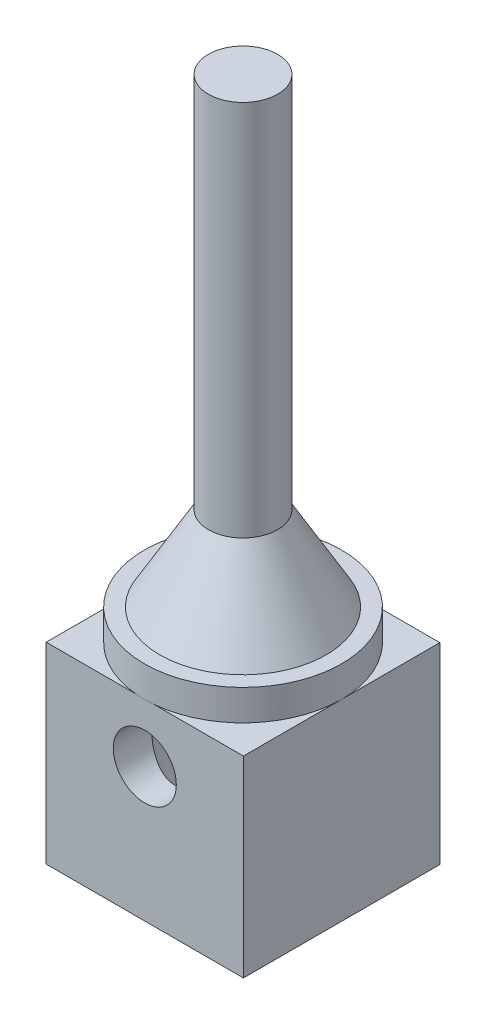
ISO-10303-21;
HEADER;
FILE_DESCRIPTION(('STEP AP214'),'2;1');
FILE_NAME('part.step','',(''),(''),'','','');
FILE_SCHEMA(('AUTOMOTIVE_DESIGN { 1 0 10303 214 1 1 1 1 }'));
ENDSEC;
DATA;
#1=APPLICATION_CONTEXT('core data for automotive mechanical design processes');
#2=APPLICATION_PROTOCOL_DEFINITION('international standard','automotive_design',2000,#1);
#3=PRODUCT_CONTEXT('',#1,'mechanical');
#4=PRODUCT('Part','Part','',(#3));
#5=PRODUCT_RELATED_PRODUCT_CATEGORY('part','',(#4));
#6=PRODUCT_DEFINITION_FORMATION('','',#4);
#7=PRODUCT_DEFINITION_CONTEXT('part definition',#1,'design');
#8=PRODUCT_DEFINITION('design','',#6,#7);
#9=PRODUCT_DEFINITION_SHAPE('','',#8);
#10=(LENGTH_UNIT() NAMED_UNIT(*) SI_UNIT(.MILLI.,.METRE.));
#11=(NAMED_UNIT(*) PLANE_ANGLE_UNIT() SI_UNIT($,.RADIAN.));
#12=(NAMED_UNIT(*) SI_UNIT($,.STERADIAN.) SOLID_ANGLE_UNIT());
#13=UNCERTAINTY_MEASURE_WITH_UNIT(LENGTH_MEASURE(1.E-05),#10,'distance_accuracy_value','');
#14=(GEOMETRIC_REPRESENTATION_CONTEXT(3) GLOBAL_UNCERTAINTY_ASSIGNED_CONTEXT((#13)) GLOBAL_UNIT_ASSIGNED_CONTEXT((#10,
#11,#12)) REPRESENTATION_CONTEXT('',''));
#15=CARTESIAN_POINT('',(0.,0.,0.));
#16=DIRECTION('',(0.,0.,1.));
#17=DIRECTION('',(1.,0.,0.));
#18=AXIS2_PLACEMENT_3D('',#15,#16,#17);
#19=CARTESIAN_POINT('',(0.,14.732,0.));
#20=DIRECTION('',(0.,1.,0.));
#21=DIRECTION('',(0.,0.,1.));
#22=AXIS2_PLACEMENT_3D('',#19,#20,#21);
#23=PLANE('',#22);
#24=CARTESIAN_POINT('',(0.,14.732,0.));
#25=DIRECTION('',(0.,1.,0.));
#26=DIRECTION('',(0.,0.,1.));
#27=AXIS2_PLACEMENT_3D('',#24,#25,#26);
#28=CIRCLE('',#27,5.49523318956449);
#29=CARTESIAN_POINT('',(0.,14.732,5.49523318956449));
#30=VERTEX_POINT('',#29);
#31=EDGE_CURVE('E11',#30,#30,#28,.F.);
#32=ORIENTED_EDGE('',*,*,#31,.T.);
#33=EDGE_LOOP('',(#32));
#34=FACE_BOUND('',#33,.T.);
#35=CARTESIAN_POINT('',(0.,14.732,0.));
#36=DIRECTION('',(0.,1.,0.));
#37=DIRECTION('',(0.,0.,1.));
#38=AXIS2_PLACEMENT_3D('',#35,#36,#37);
#39=CIRCLE('',#38,6.5151);
#40=CARTESIAN_POINT('',(0.,14.732,6.5151));
#41=VERTEX_POINT('',#40);
#42=EDGE_CURVE('E124',#41,#41,#39,.T.);
#43=ORIENTED_EDGE('',*,*,#42,.T.);
#44=EDGE_LOOP('',(#43));
#45=FACE_BOUND('',#44,.T.);
#46=ADVANCED_FACE('F32',(#34,#45),#23,.T.);
#47=CARTESIAN_POINT('',(0.,12.7,0.));
#48=DIRECTION('',(0.,-1.,0.));
#49=DIRECTION('',(0.,0.,-1.));
#50=AXIS2_PLACEMENT_3D('',#47,#48,#49);
#51=PLANE('',#50);
#52=CARTESIAN_POINT('',(0.,12.7,0.));
#53=DIRECTION('',(0.,1.,0.));
#54=DIRECTION('',(0.,0.,1.));
#55=AXIS2_PLACEMENT_3D('',#52,#53,#54);
#56=CIRCLE('',#55,6.5151);
#57=CARTESIAN_POINT('',(0.588946380890402,12.7,6.48842586229018));
#58=VERTEX_POINT('',#57);
#59=CARTESIAN_POINT('',(6.5151,12.7,0.));
#60=VERTEX_POINT('',#59);
#61=EDGE_CURVE('E47',#58,#60,#56,.T.);
#62=ORIENTED_EDGE('',*,*,#61,.F.);
#63=DIRECTION('',(1.,0.,0.));
#64=VECTOR('',#63,1.);
#65=CARTESIAN_POINT('',(-6.5151,12.7,6.48842586229018));
#66=LINE('',#65,#64);
#67=CARTESIAN_POINT('',(6.5151,12.7,6.48842586229018));
#68=VERTEX_POINT('',#67);
#69=EDGE_CURVE('E100',#58,#68,#66,.T.);
#70=ORIENTED_EDGE('',*,*,#69,.T.);
#71=DIRECTION('',(0.,0.,-1.));
#72=VECTOR('',#71,1.);
#73=CARTESIAN_POINT('',(6.5151,12.7,6.48842586229018));
#74=LINE('',#73,#72);
#75=EDGE_CURVE('E351',#68,#60,#74,.T.);
#76=ORIENTED_EDGE('',*,*,#75,.T.);
#77=EDGE_LOOP('',(#62,#70,#76));
#78=FACE_BOUND('',#77,.T.);
#79=ADVANCED_FACE('F165',(#78),#51,.F.);
#80=CARTESIAN_POINT('',(0.588946380890431,12.7,-6.48842586229018));
#81=VERTEX_POINT('',#80);
#82=EDGE_CURVE('E118',#60,#81,#56,.T.);
#83=ORIENTED_EDGE('',*,*,#82,.F.);
#84=CARTESIAN_POINT('',(6.5151,12.7,-6.48842586229018));
#85=VERTEX_POINT('',#84);
#86=EDGE_CURVE('E354',#60,#85,#74,.T.);
#87=ORIENTED_EDGE('',*,*,#86,.T.);
#88=DIRECTION('',(-1.,0.,0.));
#89=VECTOR('',#88,1.);
#90=CARTESIAN_POINT('',(-6.5151,12.7,-6.48842586229018));
#91=LINE('',#90,#89);
#92=EDGE_CURVE('E355',#85,#81,#91,.T.);
#93=ORIENTED_EDGE('',*,*,#92,.T.);
#94=EDGE_LOOP('',(#83,#87,#93));
#95=FACE_BOUND('',#94,.T.);
#96=ADVANCED_FACE('F293',(#95),#51,.F.);
#97=CARTESIAN_POINT('',(-0.588946380890431,12.7,-6.48842586229018));
#98=VERTEX_POINT('',#97);
#99=CARTESIAN_POINT('',(-6.5151,12.7,0.));
#100=VERTEX_POINT('',#99);
#101=EDGE_CURVE('E116',#98,#100,#56,.T.);
#102=ORIENTED_EDGE('',*,*,#101,.F.);
#103=CARTESIAN_POINT('',(-6.5151,12.7,-6.48842586229018));
#104=VERTEX_POINT('',#103);
#105=EDGE_CURVE('E353',#98,#104,#91,.T.);
#106=ORIENTED_EDGE('',*,*,#105,.T.);
#107=DIRECTION('',(0.,0.,1.));
#108=VECTOR('',#107,1.);
#109=CARTESIAN_POINT('',(-6.5151,12.7,6.48842586229018));
#110=LINE('',#109,#108);
#111=EDGE_CURVE('E359',#104,#100,#110,.T.);
#112=ORIENTED_EDGE('',*,*,#111,.T.);
#113=EDGE_LOOP('',(#102,#106,#112));
#114=FACE_BOUND('',#113,.T.);
#115=ADVANCED_FACE('F284',(#114),#51,.F.);
#116=CARTESIAN_POINT('',(-0.588946380890402,12.7,6.48842586229018));
#117=VERTEX_POINT('',#116);
#118=EDGE_CURVE('E55',#100,#117,#56,.T.);
#119=ORIENTED_EDGE('',*,*,#118,.F.);
#120=CARTESIAN_POINT('',(-6.5151,12.7,6.48842586229018));
#121=VERTEX_POINT('',#120);
#122=EDGE_CURVE('E93',#100,#121,#110,.T.);
#123=ORIENTED_EDGE('',*,*,#122,.T.);
#124=EDGE_CURVE('E90',#121,#117,#66,.T.);
#125=ORIENTED_EDGE('',*,*,#124,.T.);
#126=EDGE_LOOP('',(#119,#123,#125));
#127=FACE_BOUND('',#126,.T.);
#128=ADVANCED_FACE('F92',(#127),#51,.F.);
#129=CARTESIAN_POINT('',(0.,0.,0.));
#130=DIRECTION('',(0.,-1.,0.));
#131=DIRECTION('',(0.,0.,-1.));
#132=AXIS2_PLACEMENT_3D('',#129,#130,#131);
#133=PLANE('',#132);
#134=DIRECTION('',(0.,0.,-1.));
#135=VECTOR('',#134,1.);
#136=CARTESIAN_POINT('',(6.5151,0.,6.48842586229018));
#137=LINE('',#136,#135);
#138=CARTESIAN_POINT('',(6.5151,0.,6.48842586229018));
#139=VERTEX_POINT('',#138);
#140=CARTESIAN_POINT('',(6.5151,0.,-6.48842586229018));
#141=VERTEX_POINT('',#140);
#142=EDGE_CURVE('E339',#139,#141,#137,.T.);
#143=ORIENTED_EDGE('',*,*,#142,.F.);
#144=DIRECTION('',(1.,0.,0.));
#145=VECTOR('',#144,1.);
#146=CARTESIAN_POINT('',(-6.5151,0.,6.48842586229018));
#147=LINE('',#146,#145);
#148=CARTESIAN_POINT('',(-6.5151,0.,6.48842586229018));
#149=VERTEX_POINT('',#148);
#150=EDGE_CURVE('E365',#149,#139,#147,.T.);
#151=ORIENTED_EDGE('',*,*,#150,.F.);
#152=DIRECTION('',(0.,0.,1.));
#153=VECTOR('',#152,1.);
#154=CARTESIAN_POINT('',(-6.5151,0.,6.48842586229018));
#155=LINE('',#154,#153);
#156=CARTESIAN_POINT('',(-6.5151,0.,-6.48842586229018));
#157=VERTEX_POINT('',#156);
#158=EDGE_CURVE('E363',#157,#149,#155,.T.);
#159=ORIENTED_EDGE('',*,*,#158,.F.);
#160=DIRECTION('',(-1.,0.,0.));
#161=VECTOR('',#160,1.);
#162=CARTESIAN_POINT('',(-6.5151,0.,-6.48842586229018));
#163=LINE('',#162,#161);
#164=EDGE_CURVE('E345',#141,#157,#163,.T.);
#165=ORIENTED_EDGE('',*,*,#164,.F.);
#166=EDGE_LOOP('',(#143,#151,#159,#165));
#167=FACE_BOUND('',#166,.T.);
#168=CARTESIAN_POINT('',(0.,0.,0.));
#169=DIRECTION('',(0.,1.,0.));
#170=DIRECTION('',(0.,0.,1.));
#171=AXIS2_PLACEMENT_3D('',#168,#169,#170);
#172=CIRCLE('',#171,4.4831);
#173=CARTESIAN_POINT('',(0.,0.,4.4831));
#174=VERTEX_POINT('',#173);
#175=EDGE_CURVE('E342',#174,#174,#172,.T.);
#176=ORIENTED_EDGE('',*,*,#175,.T.);
#177=EDGE_LOOP('',(#176));
#178=FACE_BOUND('',#177,.T.);
#179=ADVANCED_FACE('F273',(#167,#178),#133,.T.);
#180=CARTESIAN_POINT('',(6.5151,12.7,6.48842586229018));
#181=DIRECTION('',(-1.,0.,0.));
#182=DIRECTION('',(0.,0.,1.));
#183=AXIS2_PLACEMENT_3D('',#180,#181,#182);
#184=PLANE('',#183);
#185=ORIENTED_EDGE('',*,*,#142,.T.);
#186=DIRECTION('',(0.,-1.,0.));
#187=VECTOR('',#186,1.);
#188=CARTESIAN_POINT('',(6.5151,12.7,-6.48842586229018));
#189=LINE('',#188,#187);
#190=EDGE_CURVE('E117',#85,#141,#189,.T.);
#191=ORIENTED_EDGE('',*,*,#190,.F.);
#192=ORIENTED_EDGE('',*,*,#86,.F.);
#193=ORIENTED_EDGE('',*,*,#75,.F.);
#194=DIRECTION('',(0.,-1.,0.));
#195=VECTOR('',#194,1.);
#196=CARTESIAN_POINT('',(6.5151,12.7,6.48842586229018));
#197=LINE('',#196,#195);
#198=EDGE_CURVE('E97',#68,#139,#197,.T.);
#199=ORIENTED_EDGE('',*,*,#198,.T.);
#200=EDGE_LOOP('',(#185,#191,#192,#193,#199));
#201=FACE_BOUND('',#200,.T.);
#202=ADVANCED_FACE('F263',(#201),#184,.F.);
#203=CARTESIAN_POINT('',(-6.5151,12.7,-6.48842586229018));
#204=DIRECTION('',(0.,0.,1.));
#205=DIRECTION('',(1.,0.,0.));
#206=AXIS2_PLACEMENT_3D('',#203,#204,#205);
#207=PLANE('',#206);
#208=CARTESIAN_POINT('',(0.,8.8392,-6.48842586229018));
#209=DIRECTION('',(0.,0.,1.));
#210=DIRECTION('',(1.,0.,0.));
#211=AXIS2_PLACEMENT_3D('',#208,#209,#210);
#212=CIRCLE('',#211,2.0828);
#213=CARTESIAN_POINT('',(2.0828,8.8392,-6.48842586229018));
#214=VERTEX_POINT('',#213);
#215=EDGE_CURVE('E140',#214,#214,#212,.T.);
#216=ORIENTED_EDGE('',*,*,#215,.T.);
#217=EDGE_LOOP('',(#216));
#218=FACE_BOUND('',#217,.T.);
#219=ORIENTED_EDGE('',*,*,#164,.T.);
#220=DIRECTION('',(0.,-1.,0.));
#221=VECTOR('',#220,1.);
#222=CARTESIAN_POINT('',(-6.5151,12.7,-6.48842586229018));
#223=LINE('',#222,#221);
#224=EDGE_CURVE('E120',#104,#157,#223,.T.);
#225=ORIENTED_EDGE('',*,*,#224,.F.);
#226=ORIENTED_EDGE('',*,*,#105,.F.);
#227=EDGE_CURVE('E358',#81,#98,#91,.T.);
#228=ORIENTED_EDGE('',*,*,#227,.F.);
#229=ORIENTED_EDGE('',*,*,#92,.F.);
#230=ORIENTED_EDGE('',*,*,#190,.T.);
#231=EDGE_LOOP('',(#219,#225,#226,#228,#229,#230));
#232=FACE_BOUND('',#231,.T.);
#233=ADVANCED_FACE('F253',(#218,#232),#207,.F.);
#234=CARTESIAN_POINT('',(-6.5151,12.7,6.48842586229018));
#235=DIRECTION('',(1.,0.,0.));
#236=DIRECTION('',(0.,0.,-1.));
#237=AXIS2_PLACEMENT_3D('',#234,#235,#236);
#238=PLANE('',#237);
#239=ORIENTED_EDGE('',*,*,#158,.T.);
#240=DIRECTION('',(0.,-1.,0.));
#241=VECTOR('',#240,1.);
#242=CARTESIAN_POINT('',(-6.5151,12.7,6.48842586229018));
#243=LINE('',#242,#241);
#244=EDGE_CURVE('E369',#121,#149,#243,.T.);
#245=ORIENTED_EDGE('',*,*,#244,.F.);
#246=ORIENTED_EDGE('',*,*,#122,.F.);
#247=ORIENTED_EDGE('',*,*,#111,.F.);
#248=ORIENTED_EDGE('',*,*,#224,.T.);
#249=EDGE_LOOP('',(#239,#245,#246,#247,#248));
#250=FACE_BOUND('',#249,.T.);
#251=ADVANCED_FACE('F241',(#250),#238,.F.);
#252=CARTESIAN_POINT('',(-6.5151,12.7,6.48842586229018));
#253=DIRECTION('',(0.,0.,-1.));
#254=DIRECTION('',(-1.,0.,0.));
#255=AXIS2_PLACEMENT_3D('',#252,#253,#254);
#256=PLANE('',#255);
#257=CARTESIAN_POINT('',(0.,8.8392,6.48842586229018));
#258=DIRECTION('',(0.,0.,1.));
#259=DIRECTION('',(1.,0.,0.));
#260=AXIS2_PLACEMENT_3D('',#257,#258,#259);
#261=CIRCLE('',#260,2.0828);
#262=CARTESIAN_POINT('',(2.0828,8.8392,6.48842586229018));
#263=VERTEX_POINT('',#262);
#264=EDGE_CURVE('E383',#263,#263,#261,.T.);
#265=ORIENTED_EDGE('',*,*,#264,.F.);
#266=EDGE_LOOP('',(#265));
#267=FACE_BOUND('',#266,.T.);
#268=ORIENTED_EDGE('',*,*,#150,.T.);
#269=ORIENTED_EDGE('',*,*,#198,.F.);
#270=ORIENTED_EDGE('',*,*,#69,.F.);
#271=EDGE_CURVE('E98',#117,#58,#66,.T.);
#272=ORIENTED_EDGE('',*,*,#271,.F.);
#273=ORIENTED_EDGE('',*,*,#124,.F.);
#274=ORIENTED_EDGE('',*,*,#244,.T.);
#275=EDGE_LOOP('',(#268,#269,#270,#272,#273,#274));
#276=FACE_BOUND('',#275,.T.);
#277=ADVANCED_FACE('F103',(#267,#276),#256,.F.);
#278=CARTESIAN_POINT('',(0.,12.7,0.));
#279=DIRECTION('',(0.,-1.,0.));
#280=DIRECTION('',(0.,0.,-1.));
#281=AXIS2_PLACEMENT_3D('',#278,#279,#280);
#282=CYLINDRICAL_SURFACE('',#281,4.4831);
#283=CARTESIAN_POINT('',(0.,10.922,-4.4831));
#284=CARTESIAN_POINT('',(-0.110404714718174,10.9219940443162,-4.48309501004248));
#285=CARTESIAN_POINT('',(-0.220967827175368,10.9131698043776,-4.47897663862845));
#286=CARTESIAN_POINT('',(-0.438883228508039,10.8782364114313,-4.46291014525461));
#287=CARTESIAN_POINT('',(-0.546227784770788,10.8520886514787,-4.45094453565824));
#288=CARTESIAN_POINT('',(-0.754211902341567,10.7837196117157,-4.42044764379328));
#289=CARTESIAN_POINT('',(-0.854874615300239,10.7415576467801,-4.40194060761152));
#290=CARTESIAN_POINT('',(-1.04757507560893,10.6426362667593,-4.36010410861922));
#291=CARTESIAN_POINT('',(-1.13961431373403,10.5858793811334,-4.33677548158046));
#292=CARTESIAN_POINT('',(-1.31808851669099,10.4558455072795,-4.28601197258833));
#293=CARTESIAN_POINT('',(-1.40394706104201,10.3818383391116,-4.25842283152154));
#294=CARTESIAN_POINT('',(-1.56255070032204,10.2209614977436,-4.20282019122734));
#295=CARTESIAN_POINT('',(-1.63528724132995,10.1340835010682,-4.17480642800262));
#296=CARTESIAN_POINT('',(-1.77025827113599,9.94317781189524,-4.11947013094724));
#297=CARTESIAN_POINT('',(-1.83151287696471,9.83840542856563,-4.09230870367697));
#298=CARTESIAN_POINT('',(-1.93527670683436,9.6186231498762,-4.04427772058167));
#299=CARTESIAN_POINT('',(-1.97779780319465,9.5036197940842,-4.02340418248173));
#300=CARTESIAN_POINT('',(-2.04037068078598,9.27323036426889,-3.99202260994517));
#301=CARTESIAN_POINT('',(-2.06153945970222,9.15822045676061,-3.98100316574118));
#302=CARTESIAN_POINT('',(-2.08426556322425,8.92579525780664,-3.96915677749744));
#303=CARTESIAN_POINT('',(-2.08583795653873,8.80838188411603,-3.96832200193181));
#304=CARTESIAN_POINT('',(-2.07015425065852,8.58702841126922,-3.97651767504591));
#305=CARTESIAN_POINT('',(-2.05475989998621,8.48291222146467,-3.9845727656057));
#306=CARTESIAN_POINT('',(-2.00875966330726,8.27895511626065,-4.00795819929898));
#307=CARTESIAN_POINT('',(-1.97814991778295,8.17911529258163,-4.02329038828739));
#308=CARTESIAN_POINT('',(-1.90198711052332,7.98377619492567,-4.05985747689265));
#309=CARTESIAN_POINT('',(-1.85610631414293,7.88842972130413,-4.08122011679921));
#310=CARTESIAN_POINT('',(-1.75094378265242,7.70636451745583,-4.12742971342226));
#311=CARTESIAN_POINT('',(-1.69165620819774,7.6196495704776,-4.15227818660354));
#312=CARTESIAN_POINT('',(-1.55390913320529,7.4474950394247,-4.20589761679147));
#313=CARTESIAN_POINT('',(-1.47407379827187,7.36319463902675,-4.23480308688445));
#314=CARTESIAN_POINT('',(-1.30119608054662,7.20874427764034,-4.29107631300965));
#315=CARTESIAN_POINT('',(-1.20814896766239,7.13859940649927,-4.31844351338959));
#316=CARTESIAN_POINT('',(-1.00730294505797,7.01219346449233,-4.36973965815197));
#317=CARTESIAN_POINT('',(-0.899101605865463,6.95650448066242,-4.39351467421149));
#318=CARTESIAN_POINT('',(-0.673478168169032,6.86453680527071,-4.43370093141218));
#319=CARTESIAN_POINT('',(-0.556062486043544,6.82824474188028,-4.45011724422589));
#320=CARTESIAN_POINT('',(-0.324762226058868,6.77873598612278,-4.47271697306856));
#321=CARTESIAN_POINT('',(-0.211269458631554,6.76399758042627,-4.479573400626));
#322=CARTESIAN_POINT('',(0.0167692515617219,6.75334569810538,-4.48451674414256));
#323=CARTESIAN_POINT('',(0.13131477382433,6.75742500562522,-4.4826070215782));
#324=CARTESIAN_POINT('',(0.350352875370776,6.78330992650455,-4.47064877441011));
#325=CARTESIAN_POINT('',(0.455016101972226,6.80395050045855,-4.46113531661556));
#326=CARTESIAN_POINT('',(0.659225808717147,6.86063730592771,-4.43556111558948));
#327=CARTESIAN_POINT('',(0.758771686174087,6.89668534739399,-4.41949960315294));
#328=CARTESIAN_POINT('',(0.953414883265809,6.98426139409489,-4.38170310299483));
#329=CARTESIAN_POINT('',(1.04828156540504,7.03623096796251,-4.35980896834296));
#330=CARTESIAN_POINT('',(1.22828484885711,7.15369246890446,-4.31256024738116));
#331=CARTESIAN_POINT('',(1.31341714834773,7.2191903388022,-4.28720414193257));
#332=CARTESIAN_POINT('',(1.47937378139555,7.36847693641933,-4.23295514932252));
#333=CARTESIAN_POINT('',(1.55917616855023,7.45336221822366,-4.20394661053201));
#334=CARTESIAN_POINT('',(1.70378978059977,7.63558290081284,-4.14744822424523));
#335=CARTESIAN_POINT('',(1.76859403141487,7.73292406099807,-4.11995908776968));
#336=CARTESIAN_POINT('',(1.88319752717065,7.9413165823602,-4.06888487338169));
#337=CARTESIAN_POINT('',(1.93245918563247,8.05270347679629,-4.04545023448209));
#338=CARTESIAN_POINT('',(2.0110297434131,8.28363895974501,-4.00698029500052));
#339=CARTESIAN_POINT('',(2.04036048102596,8.40317845685377,-3.99193580459198));
#340=CARTESIAN_POINT('',(2.07583925751713,8.63549981040341,-3.97359277804606));
#341=CARTESIAN_POINT('',(2.08383044372342,8.74792628272296,-3.96936185228873));
#342=CARTESIAN_POINT('',(2.08155727647963,8.97252732383154,-3.97055550105694));
#343=CARTESIAN_POINT('',(2.07129791775288,9.0847019531318,-3.97597743383388));
#344=CARTESIAN_POINT('',(2.03447146955076,9.29721953100425,-3.99493255699823));
#345=CARTESIAN_POINT('',(2.0091252750617,9.39783439919701,-4.00785685238168));
#346=CARTESIAN_POINT('',(1.94420848196343,9.59333959870775,-4.03974494211538));
#347=CARTESIAN_POINT('',(1.90463366023304,9.68822822067456,-4.05871052935774));
#348=CARTESIAN_POINT('',(1.80940993956016,9.87647755889524,-4.10208798953344));
#349=CARTESIAN_POINT('',(1.75287164692527,9.96932294155159,-4.1267769452409));
#350=CARTESIAN_POINT('',(1.62641709350287,10.1447763375204,-4.17823058312094));
#351=CARTESIAN_POINT('',(1.55649464311878,10.2273795850491,-4.20499622225121));
#352=CARTESIAN_POINT('',(1.39708860825904,10.3884823840544,-4.26076717686722));
#353=CARTESIAN_POINT('',(1.30635317612499,10.4657639050309,-4.28973156554615));
#354=CARTESIAN_POINT('',(1.11224729158568,10.6041836961388,-4.34410386368153));
#355=CARTESIAN_POINT('',(1.00887089395947,10.6653143272345,-4.36951008753986));
#356=CARTESIAN_POINT('',(0.792651919141588,10.7689796278299,-4.41384112060997));
#357=CARTESIAN_POINT('',(0.679869561904437,10.8116231739266,-4.43280373131909));
#358=CARTESIAN_POINT('',(0.447781896832297,10.8768424070225,-4.46220302307888));
#359=CARTESIAN_POINT('',(0.328497190899121,10.8994779633616,-4.4726651322958));
#360=CARTESIAN_POINT('',(0.173575693536932,10.9150476232307,-4.47987402929573));
#361=CARTESIAN_POINT('',(0.138927767985355,10.9176519696155,-4.48108137973508));
#362=CARTESIAN_POINT('',(0.0695251331909514,10.921129112446,-4.48269515853161));
#363=CARTESIAN_POINT('',(0.0347704219115384,10.9220018756594,-4.48310157151738));
#364=CARTESIAN_POINT('',(0.,10.922,-4.4831));
#365=B_SPLINE_CURVE_WITH_KNOTS('',3,(#283,#284,#285,#286,#287,#288,#289,#290,#291,#292,#293,
#294,#295,#296,#297,#298,#299,#300,#301,#302,#303,#304,#305,#306,#307,#308,#309,#310,#311,#312,
#313,#314,#315,#316,#317,#318,#319,#320,#321,#322,#323,#324,#325,#326,#327,#328,#329,#330,#331,
#332,#333,#334,#335,#336,#337,#338,#339,#340,#341,#342,#343,#344,#345,#346,#347,#348,#349,#350,
#351,#352,#353,#354,#355,#356,#357,#358,#359,#360,#361,#362,#363,#364),.UNSPECIFIED.,.T.,.F.,(4,
2,2,2,2,2,2,2,2,2,2,2,2,2,2,2,2,2,2,2,2,2,2,2,2,2,2,2,2,2,2,2,2,2,2,2,2,2,2,2,4),(0.,
0.331071957153773,0.662884229557827,0.993479304258927,1.3240171217883,1.67251864159776,
2.02124652674812,2.39246557880565,2.76344903201895,3.11382354041819,3.46392861048555,
3.77912484771106,4.09440107804349,4.41693404086443,4.7396077549621,5.09696861078639,
5.4544577333804,5.82446328456882,6.19421343163352,6.53633285139492,6.87832109266999,
7.19816262872675,7.51804174764552,7.84774859836242,8.17760059469497,8.53619776133611,
8.89496134084975,9.26503775241194,9.63470801486809,9.97122592985265,10.3076517623646,
10.6199768968782,10.9323948075391,11.2654580070081,11.5986756076294,11.9649170809758,
12.3313314700792,12.6955575970702,13.0586901346603,13.1629546195849,13.2672211055108),.UNSPECIFIED.);
#366=CARTESIAN_POINT('',(0.,10.922,-4.4831));
#367=VERTEX_POINT('',#366);
#368=EDGE_CURVE('E133',#367,#367,#365,.T.);
#369=ORIENTED_EDGE('',*,*,#368,.F.);
#370=EDGE_LOOP('',(#369));
#371=FACE_BOUND('',#370,.T.);
#372=CARTESIAN_POINT('',(2.0828,8.8392,3.96990299251758));
#373=CARTESIAN_POINT('',(2.0827927833575,8.72952449835701,3.96991115479265));
#374=CARTESIAN_POINT('',(2.07408033945345,8.61968109991453,3.97451552280375));
#375=CARTESIAN_POINT('',(2.0396307454592,8.40327653037595,3.99229836009563));
#376=CARTESIAN_POINT('',(2.01385294491427,8.29672383374458,4.00549730080435));
#377=CARTESIAN_POINT('',(1.94656310874602,8.09042548865129,4.03862150010714));
#378=CARTESIAN_POINT('',(1.9051258762667,7.99065009808362,4.05851473218031));
#379=CARTESIAN_POINT('',(1.80791929422052,7.79949173082665,4.1027375020214));
#380=CARTESIAN_POINT('',(1.7521509534299,7.70810816404561,4.1270667275018));
#381=CARTESIAN_POINT('',(1.62323113005682,7.52917005809339,4.17953062282432));
#382=CARTESIAN_POINT('',(1.54912941534676,7.44234301365862,4.20781272825012));
#383=CARTESIAN_POINT('',(1.38763111538317,7.28179549649979,4.26379750973618));
#384=CARTESIAN_POINT('',(1.30022865495294,7.20808084711785,4.29149992355473));
#385=CARTESIAN_POINT('',(1.10858735658762,7.07180933213391,4.34507206622742));
#386=CARTESIAN_POINT('',(1.00367793836846,7.01011355433965,4.37075099720458));
#387=CARTESIAN_POINT('',(0.783555391010992,6.9055719454046,4.4155189452658));
#388=CARTESIAN_POINT('',(0.668347938749927,6.86271580493335,4.43461156524292));
#389=CARTESIAN_POINT('',(0.438577782487469,6.79984074632118,4.46300127380352));
#390=CARTESIAN_POINT('',(0.324429770749793,6.77855563038912,4.4728386634339));
#391=CARTESIAN_POINT('',(0.0937889769764849,6.75529174523066,4.48360234540226));
#392=CARTESIAN_POINT('',(-0.0227025716203441,6.75330307328727,4.48453320846561));
#393=CARTESIAN_POINT('',(-0.245345972496489,6.76812118637053,4.4776631989624));
#394=CARTESIAN_POINT('',(-0.351615652092465,6.78352334831833,4.4705148272363));
#395=CARTESIAN_POINT('',(-0.559859722529503,6.83021971634481,4.44923601474068));
#396=CARTESIAN_POINT('',(-0.661833793862421,6.86151510231209,4.43510505559667));
#397=CARTESIAN_POINT('',(-0.8604666197267,6.9394079454234,4.40092043340717));
#398=CARTESIAN_POINT('',(-0.957023050497446,6.98622729125575,4.38078133932647));
#399=CARTESIAN_POINT('',(-1.14115862862094,7.09358173320072,4.33646456128325));
#400=CARTESIAN_POINT('',(-1.22873446646485,7.15412185947097,4.31228539705216));
#401=CARTESIAN_POINT('',(-1.40030040321121,7.29310514502386,4.25981883235333));
#402=CARTESIAN_POINT('',(-1.4833631622597,7.37262843458992,4.23135693242498));
#403=CARTESIAN_POINT('',(-1.63543294889738,7.54437079989028,4.17494149694441));
#404=CARTESIAN_POINT('',(-1.70443168885083,7.63659730804074,4.1469882699269));
#405=CARTESIAN_POINT('',(-1.82966901466324,7.83672072208406,4.09333247991753));
#406=CARTESIAN_POINT('',(-1.88511815422391,7.94516354250695,4.06780694017736));
#407=CARTESIAN_POINT('',(-1.97657515003725,8.17133113417204,4.02416854362329));
#408=CARTESIAN_POINT('',(-2.01260070197538,8.28904734451283,4.00604894334866));
#409=CARTESIAN_POINT('',(-2.06152472884605,8.52113056896976,3.98108117321934));
#410=CARTESIAN_POINT('',(-2.07594444622907,8.63509515983263,3.973494706332));
#411=CARTESIAN_POINT('',(-2.08579663731934,8.86404377281304,3.96833465359248));
#412=CARTESIAN_POINT('',(-2.08123888609431,8.97902723966956,3.97075591287522));
#413=CARTESIAN_POINT('',(-2.05466007122154,9.19602202043299,3.98456236329933));
#414=CARTESIAN_POINT('',(-2.03421045521211,9.29828469793603,3.99514029646733));
#415=CARTESIAN_POINT('',(-1.97864844750699,9.49778555307777,4.02294587623976));
#416=CARTESIAN_POINT('',(-1.94353200373067,9.59502233383679,4.04017536040308));
#417=CARTESIAN_POINT('',(-1.85788894372026,9.78674046593464,4.08028920094069));
#418=CARTESIAN_POINT('',(-1.80672906755474,9.88089056349402,4.10339678885434));
#419=CARTESIAN_POINT('',(-1.69103388999278,10.0597821131407,4.15241308842967));
#420=CARTESIAN_POINT('',(-1.62649200731089,10.1445189041429,4.17832317535302));
#421=CARTESIAN_POINT('',(-1.47786486135823,10.3115269680444,4.23332183795222));
#422=CARTESIAN_POINT('',(-1.3924351896019,10.3925917201973,4.2624569905399));
#423=CARTESIAN_POINT('',(-1.20861050635906,10.5395422344074,4.31817840130377));
#424=CARTESIAN_POINT('',(-1.1102128705596,10.6054249166483,4.34476414167176));
#425=CARTESIAN_POINT('',(-0.901155774888626,10.7207993646396,4.39292092876272));
#426=CARTESIAN_POINT('',(-0.79034352191261,10.770047950892,4.41441630830809));
#427=CARTESIAN_POINT('',(-0.560728742588655,10.848761562897,4.44940601842164));
#428=CARTESIAN_POINT('',(-0.441932324352204,10.8782415268559,4.46290638953319));
#429=CARTESIAN_POINT('',(-0.210362104457896,10.9143821942641,4.47954030542873));
#430=CARTESIAN_POINT('',(-0.0979060436893999,10.9227328000029,4.48344083541863));
#431=CARTESIAN_POINT('',(0.12683616086077,10.9211667394413,4.48271249223244));
#432=CARTESIAN_POINT('',(0.239122341396004,10.9112548511497,4.47808585001672));
#433=CARTESIAN_POINT('',(0.454285602206512,10.8746310977765,4.46126301809238));
#434=CARTESIAN_POINT('',(0.557349217424486,10.8488125510597,4.449469757674));
#435=CARTESIAN_POINT('',(0.757572457646882,10.7822073839363,4.41978745089237));
#436=CARTESIAN_POINT('',(0.854731112761049,10.7414183123224,4.40189740630305));
#437=CARTESIAN_POINT('',(1.04529661323856,10.6440210597509,4.36067392602946));
#438=CARTESIAN_POINT('',(1.13833236855787,10.5867782840614,4.3371300833478));
#439=CARTESIAN_POINT('',(1.3138854862799,10.4589427526189,4.28721743087265));
#440=CARTESIAN_POINT('',(1.39639811010133,10.3883440179444,4.26084735819114));
#441=CARTESIAN_POINT('',(1.55604851066417,10.2286557765132,4.20531178539251));
#442=CARTESIAN_POINT('',(1.63210351890008,10.1384949071307,4.17610183001891));
#443=CARTESIAN_POINT('',(1.76829619006422,9.94604415883332,4.12028438779202));
#444=CARTESIAN_POINT('',(1.82842272148439,9.8437458696722,4.0936787290778));
#445=CARTESIAN_POINT('',(1.93147948237077,9.62779655249687,4.0460927141025));
#446=CARTESIAN_POINT('',(1.97418614883479,9.5140199690647,4.02518656701328));
#447=CARTESIAN_POINT('',(2.0229890684014,9.33846862482947,4.00075213764538));
#448=CARTESIAN_POINT('',(2.03670819932408,9.27919420376616,3.99376473358273));
#449=CARTESIAN_POINT('',(2.05893058308758,9.15944677001547,3.98235496213139));
#450=CARTESIAN_POINT('',(2.06743765782698,9.09897466923548,3.97793071535954));
#451=CARTESIAN_POINT('',(2.07644362111035,9.00515458510634,3.9732328180476));
#452=CARTESIAN_POINT('',(2.07882540756941,8.97202280889144,3.97198641320559));
#453=CARTESIAN_POINT('',(2.08200472568274,8.90566583207757,3.97032024523285));
#454=CARTESIAN_POINT('',(2.08280218723162,8.87244062740961,3.96990051868212));
#455=CARTESIAN_POINT('',(2.0828,8.8392,3.96990299251758));
#456=B_SPLINE_CURVE_WITH_KNOTS('',3,(#372,#373,#374,#375,#376,#377,#378,#379,#380,#381,#382,
#383,#384,#385,#386,#387,#388,#389,#390,#391,#392,#393,#394,#395,#396,#397,#398,#399,#400,#401,
#402,#403,#404,#405,#406,#407,#408,#409,#410,#411,#412,#413,#414,#415,#416,#417,#418,#419,#420,
#421,#422,#423,#424,#425,#426,#427,#428,#429,#430,#431,#432,#433,#434,#435,#436,#437,#438,#439,
#440,#441,#442,#443,#444,#445,#446,#447,#448,#449,#450,#451,#452,#453,#454,#455),.UNSPECIFIED.,
.T.,.F.,(4,2,2,2,2,2,2,2,2,2,2,2,2,2,2,2,2,2,2,2,2,2,2,2,2,2,2,2,2,2,2,2,2,2,2,2,2,2,2,2,2,4),
(0.,0.328893049495543,0.658572369761173,0.986696361597179,1.31479726289125,1.66609494961126,
2.01754826363489,2.38877488670901,2.75979811540022,3.10749901796704,3.45502147491695,
3.77636419635613,4.09773077727496,4.42390441303241,4.75019782087024,5.104045830254,
5.45810175594148,5.82947980495805,6.20051893915813,6.5439527133131,6.88720961071697,
7.20027153541469,7.51342000862746,7.84093985605142,8.16862116179265,8.53092542794378,
8.89330312612726,9.26076988121084,9.62795864532092,9.96469140567155,10.3013360792817,
10.6206089704214,10.9399341612253,11.2737693678808,11.6077543741817,11.9706369720076,
12.3337725028579,12.7014319708817,12.8849224135554,13.068278144744,13.1679551685365,
13.267636602878),.UNSPECIFIED.);
#457=CARTESIAN_POINT('',(2.0828,8.8392,3.96990299251758));
#458=VERTEX_POINT('',#457);
#459=EDGE_CURVE('E141',#458,#458,#456,.T.);
#460=ORIENTED_EDGE('',*,*,#459,.F.);
#461=EDGE_LOOP('',(#460));
#462=FACE_BOUND('',#461,.T.);
#463=CARTESIAN_POINT('',(0.,12.7,0.));
#464=DIRECTION('',(0.,1.,0.));
#465=DIRECTION('',(0.,0.,1.));
#466=AXIS2_PLACEMENT_3D('',#463,#464,#465);
#467=CIRCLE('',#466,4.4831);
#468=CARTESIAN_POINT('',(0.,12.7,4.4831));
#469=VERTEX_POINT('',#468);
#470=EDGE_CURVE('E127',#469,#469,#467,.T.);
#471=ORIENTED_EDGE('',*,*,#470,.T.);
#472=EDGE_LOOP('',(#471));
#473=FACE_BOUND('',#472,.T.);
#474=ORIENTED_EDGE('',*,*,#175,.F.);
#475=EDGE_LOOP('',(#474));
#476=FACE_BOUND('',#475,.T.);
#477=ADVANCED_FACE('F144',(#371,#462,#473,#476),#282,.F.);
#478=CARTESIAN_POINT('',(0.,8.8392,-8.75157413770982));
#479=DIRECTION('',(0.,0.,1.));
#480=DIRECTION('',(1.,0.,0.));
#481=AXIS2_PLACEMENT_3D('',#478,#479,#480);
#482=CYLINDRICAL_SURFACE('',#481,2.0828);
#483=ORIENTED_EDGE('',*,*,#459,.T.);
#484=EDGE_LOOP('',(#483));
#485=FACE_BOUND('',#484,.T.);
#486=ORIENTED_EDGE('',*,*,#264,.T.);
#487=EDGE_LOOP('',(#486));
#488=FACE_BOUND('',#487,.T.);
#489=ADVANCED_FACE('F147',(#485,#488),#482,.F.);
#490=ORIENTED_EDGE('',*,*,#368,.T.);
#491=EDGE_LOOP('',(#490));
#492=FACE_BOUND('',#491,.T.);
#493=ORIENTED_EDGE('',*,*,#215,.F.);
#494=EDGE_LOOP('',(#493));
#495=FACE_BOUND('',#494,.T.);
#496=ADVANCED_FACE('F151',(#492,#495),#482,.F.);
#497=CARTESIAN_POINT('',(0.,14.732,0.));
#498=DIRECTION('',(0.,-1.,0.));
#499=DIRECTION('',(0.,0.,-1.));
#500=AXIS2_PLACEMENT_3D('',#497,#498,#499);
#501=CYLINDRICAL_SURFACE('',#500,6.5151);
#502=ORIENTED_EDGE('',*,*,#42,.F.);
#503=EDGE_LOOP('',(#502));
#504=FACE_BOUND('',#503,.T.);
#505=ORIENTED_EDGE('',*,*,#61,.T.);
#506=ORIENTED_EDGE('',*,*,#82,.T.);
#507=EDGE_CURVE('E110',#81,#98,#56,.T.);
#508=ORIENTED_EDGE('',*,*,#507,.T.);
#509=ORIENTED_EDGE('',*,*,#101,.T.);
#510=ORIENTED_EDGE('',*,*,#118,.T.);
#511=EDGE_CURVE('E107',#117,#58,#56,.T.);
#512=ORIENTED_EDGE('',*,*,#511,.T.);
#513=EDGE_LOOP('',(#505,#506,#508,#509,#510,#512));
#514=FACE_BOUND('',#513,.T.);
#515=ADVANCED_FACE('F114',(#504,#514),#501,.T.);
#516=CARTESIAN_POINT('',(0.,12.7,0.));
#517=DIRECTION('',(0.,1.,0.));
#518=DIRECTION('',(0.,0.,1.));
#519=AXIS2_PLACEMENT_3D('',#516,#517,#518);
#520=PLANE('',#519);
#521=ORIENTED_EDGE('',*,*,#511,.F.);
#522=ORIENTED_EDGE('',*,*,#271,.T.);
#523=EDGE_LOOP('',(#521,#522));
#524=FACE_BOUND('',#523,.T.);
#525=ADVANCED_FACE('F108',(#524),#520,.F.);
#526=ORIENTED_EDGE('',*,*,#507,.F.);
#527=ORIENTED_EDGE('',*,*,#227,.T.);
#528=EDGE_LOOP('',(#526,#527));
#529=FACE_BOUND('',#528,.T.);
#530=ADVANCED_FACE('F161',(#529),#520,.F.);
#531=ORIENTED_EDGE('',*,*,#470,.F.);
#532=EDGE_LOOP('',(#531));
#533=FACE_BOUND('',#532,.T.);
#534=ADVANCED_FACE('F157',(#533),#520,.F.);
#535=CARTESIAN_POINT('',(0.,45.212,0.));
#536=DIRECTION('',(0.,-1.,0.));
#537=DIRECTION('',(0.,0.,-1.));
#538=AXIS2_PLACEMENT_3D('',#535,#536,#537);
#539=CYLINDRICAL_SURFACE('',#538,2.286);
#540=CARTESIAN_POINT('',(0.,20.2905549376621,0.));
#541=DIRECTION('',(0.,1.,0.));
#542=DIRECTION('',(0.,0.,1.));
#543=AXIS2_PLACEMENT_3D('',#540,#541,#542);
#544=CIRCLE('',#543,2.286);
#545=CARTESIAN_POINT('',(0.,20.2905549376621,-2.286));
#546=VERTEX_POINT('',#545);
#547=EDGE_CURVE('E40',#546,#546,#544,.T.);
#548=CARTESIAN_POINT('',(0.,45.212,0.));
#549=DIRECTION('',(0.,1.,0.));
#550=DIRECTION('',(0.,0.,1.));
#551=AXIS2_PLACEMENT_3D('',#548,#549,#550);
#552=CIRCLE('',#551,2.286);
#553=CARTESIAN_POINT('',(0.,45.212,-2.286));
#554=VERTEX_POINT('',#553);
#555=EDGE_CURVE('E111',#554,#554,#552,.T.);
#556=CARTESIAN_POINT('',(0.,20.2905549376621,-2.286));
#557=CARTESIAN_POINT('',(0.,20.5501533237281,-2.286));
#558=CARTESIAN_POINT('',(0.,20.8097517097941,-2.286));
#559=CARTESIAN_POINT('',(0.,21.3289484819262,-2.286));
#560=CARTESIAN_POINT('',(0.,21.5885468679922,-2.286));
#561=CARTESIAN_POINT('',(0.,22.1077436401242,-2.286));
#562=CARTESIAN_POINT('',(0.,22.3673420261902,-2.286));
#563=CARTESIAN_POINT('',(0.,22.8865387983223,-2.286));
#564=CARTESIAN_POINT('',(0.,23.1461371843883,-2.286));
#565=CARTESIAN_POINT('',(0.,23.6653339565203,-2.286));
#566=CARTESIAN_POINT('',(0.,23.9249323425864,-2.286));
#567=CARTESIAN_POINT('',(0.,24.4441291147184,-2.286));
#568=CARTESIAN_POINT('',(0.,24.7037275007844,-2.286));
#569=CARTESIAN_POINT('',(0.,25.2229242729165,-2.286));
#570=CARTESIAN_POINT('',(0.,25.4825226589825,-2.286));
#571=CARTESIAN_POINT('',(0.,26.0017194311145,-2.286));
#572=CARTESIAN_POINT('',(0.,26.2613178171805,-2.286));
#573=CARTESIAN_POINT('',(0.,26.7805145893126,-2.286));
#574=CARTESIAN_POINT('',(0.,27.0401129753786,-2.286));
#575=CARTESIAN_POINT('',(0.,27.5593097475106,-2.286));
#576=CARTESIAN_POINT('',(0.,27.8189081335767,-2.286));
#577=CARTESIAN_POINT('',(0.,28.3381049057087,-2.286));
#578=CARTESIAN_POINT('',(0.,28.5977032917747,-2.286));
#579=CARTESIAN_POINT('',(0.,29.1169000639068,-2.286));
#580=CARTESIAN_POINT('',(0.,29.3764984499728,-2.286));
#581=CARTESIAN_POINT('',(0.,29.8956952221048,-2.286));
#582=CARTESIAN_POINT('',(0.,30.1552936081708,-2.286));
#583=CARTESIAN_POINT('',(0.,30.6744903803029,-2.286));
#584=CARTESIAN_POINT('',(0.,30.9340887663689,-2.286));
#585=CARTESIAN_POINT('',(0.,31.4532855385009,-2.286));
#586=CARTESIAN_POINT('',(0.,31.712883924567,-2.286));
#587=CARTESIAN_POINT('',(0.,32.232080696699,-2.286));
#588=CARTESIAN_POINT('',(0.,32.491679082765,-2.286));
#589=CARTESIAN_POINT('',(0.,33.0108758548971,-2.286));
#590=CARTESIAN_POINT('',(0.,33.2704742409631,-2.286));
#591=CARTESIAN_POINT('',(0.,33.7896710130951,-2.286));
#592=CARTESIAN_POINT('',(0.,34.0492693991611,-2.286));
#593=CARTESIAN_POINT('',(0.,34.5684661712932,-2.286));
#594=CARTESIAN_POINT('',(0.,34.8280645573592,-2.286));
#595=CARTESIAN_POINT('',(0.,35.3472613294912,-2.286));
#596=CARTESIAN_POINT('',(0.,35.6068597155573,-2.286));
#597=CARTESIAN_POINT('',(0.,36.1260564876893,-2.286));
#598=CARTESIAN_POINT('',(0.,36.3856548737553,-2.286));
#599=CARTESIAN_POINT('',(0.,36.9048516458874,-2.286));
#600=CARTESIAN_POINT('',(0.,37.1644500319534,-2.286));
#601=CARTESIAN_POINT('',(0.,37.6836468040854,-2.286));
#602=CARTESIAN_POINT('',(0.,37.9432451901514,-2.286));
#603=CARTESIAN_POINT('',(0.,38.4624419622835,-2.286));
#604=CARTESIAN_POINT('',(0.,38.7220403483495,-2.286));
#605=CARTESIAN_POINT('',(0.,39.2412371204815,-2.286));
#606=CARTESIAN_POINT('',(0.,39.5008355065476,-2.286));
#607=CARTESIAN_POINT('',(0.,40.0200322786796,-2.286));
#608=CARTESIAN_POINT('',(0.,40.2796306647456,-2.286));
#609=CARTESIAN_POINT('',(0.,40.7988274368777,-2.286));
#610=CARTESIAN_POINT('',(0.,41.0584258229437,-2.286));
#611=CARTESIAN_POINT('',(0.,41.5776225950757,-2.286));
#612=CARTESIAN_POINT('',(0.,41.8372209811417,-2.286));
#613=CARTESIAN_POINT('',(0.,42.3564177532738,-2.286));
#614=CARTESIAN_POINT('',(0.,42.6160161393398,-2.286));
#615=CARTESIAN_POINT('',(0.,43.1352129114718,-2.286));
#616=CARTESIAN_POINT('',(0.,43.3948112975379,-2.286));
#617=CARTESIAN_POINT('',(0.,43.9140080696699,-2.286));
#618=CARTESIAN_POINT('',(0.,44.1736064557359,-2.286));
#619=CARTESIAN_POINT('',(0.,44.6928032278679,-2.286));
#620=CARTESIAN_POINT('',(0.,44.952401613934,-2.286));
#621=CARTESIAN_POINT('',(0.,45.212,-2.286));
#622=B_SPLINE_CURVE_WITH_KNOTS('',3,(#556,#557,#558,#559,#560,#561,#562,#563,#564,#565,#566,
#567,#568,#569,#570,#571,#572,#573,#574,#575,#576,#577,#578,#579,#580,#581,#582,#583,#584,#585,
#586,#587,#588,#589,#590,#591,#592,#593,#594,#595,#596,#597,#598,#599,#600,#601,#602,#603,#604,
#605,#606,#607,#608,#609,#610,#611,#612,#613,#614,#615,#616,#617,#618,#619,#620,#621),
.UNSPECIFIED.,.F.,.F.,(4,2,2,2,2,2,2,2,2,2,2,2,2,2,2,2,2,2,2,2,2,2,2,2,2,2,2,2,2,2,2,2,4),(0.,
0.778795158198061,1.55759031639612,2.33638547459418,3.11518063279224,3.8939757909903,
4.67277094918836,5.45156610738642,6.23036126558448,7.00915642378254,7.7879515819806,
8.56674674017865,9.34554189837672,10.1243370565748,10.9031322147728,11.6819273729709,
12.460722531169,13.239517689367,14.0183128475651,14.7971080057631,15.5759031639612,
16.3546983221592,17.1334934803573,17.9122886385554,18.6910837967534,19.4698789549515,
20.2486741131496,21.0274692713476,21.8062644295457,22.5850595877437,23.3638547459418,
24.1426499041398,24.9214450623379),.UNSPECIFIED.);
#623=EDGE_CURVE('BSEAM160',#546,#554,#622,.T.);
#624=ORIENTED_EDGE('',*,*,#547,.T.);
#625=ORIENTED_EDGE('',*,*,#555,.F.);
#626=ORIENTED_EDGE('',*,*,#623,.T.);
#627=ORIENTED_EDGE('',*,*,#623,.F.);
#628=EDGE_LOOP('',(#624,#626,#625,#627));
#629=FACE_BOUND('',#628,.T.);
#630=ADVANCED_FACE('F160',(#629),#539,.T.);
#631=CARTESIAN_POINT('',(0.,45.212,0.));
#632=DIRECTION('',(0.,1.,0.));
#633=DIRECTION('',(0.,0.,1.));
#634=AXIS2_PLACEMENT_3D('',#631,#632,#633);
#635=PLANE('',#634);
#636=ORIENTED_EDGE('',*,*,#555,.T.);
#637=EDGE_LOOP('',(#636));
#638=FACE_BOUND('',#637,.T.);
#639=ADVANCED_FACE('F169',(#638),#635,.T.);
#640=CARTESIAN_POINT('',(0.,20.2905549376621,0.));
#641=DIRECTION('',(0.,-1.,0.));
#642=DIRECTION('',(0.,0.,-1.));
#643=AXIS2_PLACEMENT_3D('',#640,#641,#642);
#644=CONICAL_SURFACE('',#643,2.286,0.523598775598294);
#645=ORIENTED_EDGE('',*,*,#31,.F.);
#646=EDGE_LOOP('',(#645));
#647=FACE_BOUND('',#646,.T.);
#648=ORIENTED_EDGE('',*,*,#547,.F.);
#649=EDGE_LOOP('',(#648));
#650=FACE_BOUND('',#649,.T.);
#651=ADVANCED_FACE('F34',(#647,#650),#644,.T.);
#652=CLOSED_SHELL('',(#46,#79,#96,#115,#128,#179,#202,#233,#251,#277,#477,#489,#496,#515,#525,
#530,#534,#630,#639,#651));
#653=MANIFOLD_SOLID_BREP('B2',#652);
#654=ADVANCED_BREP_SHAPE_REPRESENTATION('',(#18,#653),#14);
#655=SHAPE_DEFINITION_REPRESENTATION(#9,#654);
ENDSEC;
END-ISO-10303-21;
